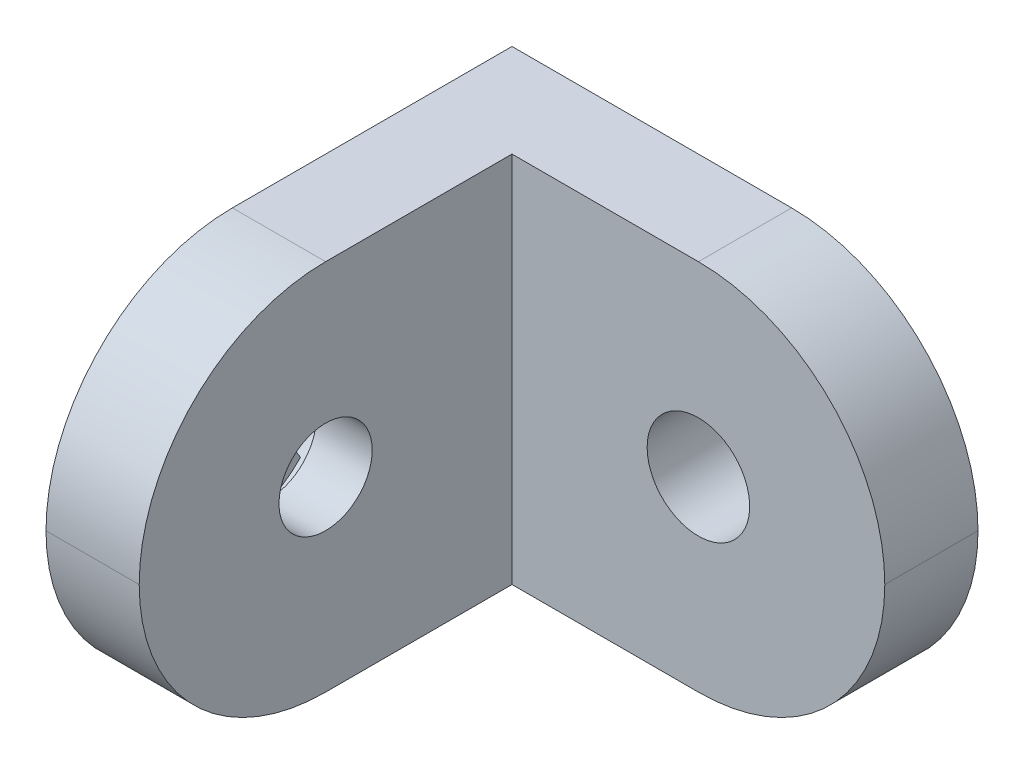
ISO-10303-21;
HEADER;
FILE_DESCRIPTION(('STEP AP214'),'2;1');
FILE_NAME('part.step','',(''),(''),'','','');
FILE_SCHEMA(('AUTOMOTIVE_DESIGN { 1 0 10303 214 1 1 1 1 }'));
ENDSEC;
DATA;
#1=APPLICATION_CONTEXT('core data for automotive mechanical design processes');
#2=APPLICATION_PROTOCOL_DEFINITION('international standard','automotive_design',2000,#1);
#3=PRODUCT_CONTEXT('',#1,'mechanical');
#4=PRODUCT('Part','Part','',(#3));
#5=PRODUCT_RELATED_PRODUCT_CATEGORY('part','',(#4));
#6=PRODUCT_DEFINITION_FORMATION('','',#4);
#7=PRODUCT_DEFINITION_CONTEXT('part definition',#1,'design');
#8=PRODUCT_DEFINITION('design','',#6,#7);
#9=PRODUCT_DEFINITION_SHAPE('','',#8);
#10=(LENGTH_UNIT() NAMED_UNIT(*) SI_UNIT(.MILLI.,.METRE.));
#11=(NAMED_UNIT(*) PLANE_ANGLE_UNIT() SI_UNIT($,.RADIAN.));
#12=(NAMED_UNIT(*) SI_UNIT($,.STERADIAN.) SOLID_ANGLE_UNIT());
#13=UNCERTAINTY_MEASURE_WITH_UNIT(LENGTH_MEASURE(1.E-05),#10,'distance_accuracy_value','');
#14=(GEOMETRIC_REPRESENTATION_CONTEXT(3) GLOBAL_UNCERTAINTY_ASSIGNED_CONTEXT((#13)) GLOBAL_UNIT_ASSIGNED_CONTEXT((#10,
#11,#12)) REPRESENTATION_CONTEXT('',''));
#15=CARTESIAN_POINT('',(0.,0.,0.));
#16=DIRECTION('',(0.,0.,1.));
#17=DIRECTION('',(1.,0.,0.));
#18=AXIS2_PLACEMENT_3D('',#15,#16,#17);
#19=CARTESIAN_POINT('',(55.,12.7,0.));
#20=DIRECTION('',(0.,1.,0.));
#21=DIRECTION('',(0.,0.,1.));
#22=AXIS2_PLACEMENT_3D('',#19,#20,#21);
#23=PLANE('',#22);
#24=DIRECTION('',(1.,0.,0.));
#25=VECTOR('',#24,1.);
#26=CARTESIAN_POINT('',(55.,12.7,0.));
#27=LINE('',#26,#25);
#28=CARTESIAN_POINT('',(35.0093624094842,12.7,0.));
#29=VERTEX_POINT('',#28);
#30=CARTESIAN_POINT('',(45.,12.7,0.));
#31=VERTEX_POINT('',#30);
#32=EDGE_CURVE('E215',#29,#31,#27,.T.);
#33=ORIENTED_EDGE('',*,*,#32,.T.);
#34=DIRECTION('',(0.,0.,1.));
#35=VECTOR('',#34,1.);
#36=CARTESIAN_POINT('',(45.,12.7,0.));
#37=LINE('',#36,#35);
#38=CARTESIAN_POINT('',(45.,12.7,4.99999999999999));
#39=VERTEX_POINT('',#38);
#40=EDGE_CURVE('E286',#39,#31,#37,.F.);
#41=ORIENTED_EDGE('',*,*,#40,.F.);
#42=DIRECTION('',(-1.,0.,0.));
#43=VECTOR('',#42,1.);
#44=CARTESIAN_POINT('',(55.,12.7,4.99999999999999));
#45=LINE('',#44,#43);
#46=CARTESIAN_POINT('',(35.0093624094842,12.7,4.99999999999999));
#47=VERTEX_POINT('',#46);
#48=EDGE_CURVE('E231',#39,#47,#45,.T.);
#49=ORIENTED_EDGE('',*,*,#48,.T.);
#50=DIRECTION('',(0.,0.,1.));
#51=VECTOR('',#50,1.);
#52=CARTESIAN_POINT('',(35.0093624094842,12.7,5.));
#53=LINE('',#52,#51);
#54=EDGE_CURVE('E292',#29,#47,#53,.T.);
#55=ORIENTED_EDGE('',*,*,#54,.F.);
#56=EDGE_LOOP('',(#33,#41,#49,#55));
#57=FACE_BOUND('',#56,.T.);
#58=ADVANCED_FACE('F35',(#57),#23,.F.);
#59=CARTESIAN_POINT('',(55.,32.7,4.99999999999999));
#60=DIRECTION('',(0.,0.,-1.));
#61=DIRECTION('',(1.,0.,0.));
#62=AXIS2_PLACEMENT_3D('',#59,#60,#61);
#63=PLANE('',#62);
#64=DIRECTION('',(-0.598801388197791,-0.800897557426915,0.));
#65=VECTOR('',#64,1.);
#66=CARTESIAN_POINT('',(46.1529562742384,39.3146063442278,4.99999999999999));
#67=LINE('',#66,#65);
#68=CARTESIAN_POINT('',(25.8009031631259,12.0937114923126,4.99999999999999));
#69=VERTEX_POINT('',#68);
#70=CARTESIAN_POINT('',(24.1612511255535,9.90067497335245,5.));
#71=VERTEX_POINT('',#70);
#72=EDGE_CURVE('E200',#69,#71,#67,.T.);
#73=ORIENTED_EDGE('',*,*,#72,.T.);
#74=DIRECTION('',(0.800897557426915,-0.598801388197791,0.));
#75=VECTOR('',#74,1.);
#76=CARTESIAN_POINT('',(33.008294851315,3.28606862912467,4.99999999999999));
#77=LINE('',#76,#75);
#78=CARTESIAN_POINT('',(20.9576608958458,12.2958805261436,5.));
#79=VERTEX_POINT('',#78);
#80=EDGE_CURVE('E203',#79,#71,#77,.T.);
#81=ORIENTED_EDGE('',*,*,#80,.F.);
#82=DIRECTION('',(-0.598801388197791,-0.800897557426915,0.));
#83=VECTOR('',#82,1.);
#84=CARTESIAN_POINT('',(42.9493660445308,41.7098118970189,4.99999999999999));
#85=LINE('',#84,#83);
#86=CARTESIAN_POINT('',(29.4026926722808,23.5911204094308,4.99999999999999));
#87=VERTEX_POINT('',#86);
#88=EDGE_CURVE('E197',#87,#79,#85,.T.);
#89=ORIENTED_EDGE('',*,*,#88,.F.);
#90=CARTESIAN_POINT('',(27.,25.3875245740242,4.99999999999999));
#91=DIRECTION('',(0.,0.,1.));
#92=DIRECTION('',(1.,0.,0.));
#93=AXIS2_PLACEMENT_3D('',#90,#91,#92);
#94=CIRCLE('',#93,3.);
#95=CARTESIAN_POINT('',(30.,25.3875245740242,4.99999999999999));
#96=VERTEX_POINT('',#95);
#97=EDGE_CURVE('E342',#96,#87,#94,.F.);
#98=ORIENTED_EDGE('',*,*,#97,.F.);
#99=DIRECTION('',(0.,1.,0.));
#100=VECTOR('',#99,1.);
#101=CARTESIAN_POINT('',(30.,0.,4.99999999999999));
#102=LINE('',#101,#100);
#103=CARTESIAN_POINT('',(30.,32.7,4.99999999999999));
#104=VERTEX_POINT('',#103);
#105=EDGE_CURVE('E241',#96,#104,#102,.T.);
#106=ORIENTED_EDGE('',*,*,#105,.T.);
#107=CARTESIAN_POINT('',(20.0000314668095,32.7250865541764,4.99999999999999));
#108=DIRECTION('',(0.,0.,1.));
#109=DIRECTION('',(1.,0.,0.));
#110=AXIS2_PLACEMENT_3D('',#107,#108,#109);
#111=CIRCLE('',#110,10.);
#112=CARTESIAN_POINT('',(28.0090070410787,26.7370726721985,4.99999999999999));
#113=VERTEX_POINT('',#112);
#114=EDGE_CURVE('E330',#113,#104,#111,.T.);
#115=ORIENTED_EDGE('',*,*,#114,.F.);
#116=DIRECTION('',(0.598801388197791,0.800897557426915,0.));
#117=VECTOR('',#116,1.);
#118=CARTESIAN_POINT('',(40.54667337225,43.5062160616123,4.99999999999999));
#119=LINE('',#118,#117);
#120=CARTESIAN_POINT('',(13.9955122128654,7.99400694098895,4.99999999999999));
#121=VERTEX_POINT('',#120);
#122=EDGE_CURVE('E232',#121,#113,#119,.T.);
#123=ORIENTED_EDGE('',*,*,#122,.F.);
#124=CARTESIAN_POINT('',(18.,5.,4.99999999999999));
#125=DIRECTION('',(0.,0.,1.));
#126=DIRECTION('',(1.,0.,0.));
#127=AXIS2_PLACEMENT_3D('',#124,#125,#126);
#128=CIRCLE('',#127,5.);
#129=CARTESIAN_POINT('',(22.0044877871346,2.00599305901105,4.99999999999999));
#130=VERTEX_POINT('',#129);
#131=EDGE_CURVE('E274',#130,#121,#128,.T.);
#132=ORIENTED_EDGE('',*,*,#131,.F.);
#133=DIRECTION('',(-0.598801388197791,-0.800897557426915,0.));
#134=VECTOR('',#133,1.);
#135=CARTESIAN_POINT('',(48.5556489465192,37.5182021796344,4.99999999999999));
#136=LINE('',#135,#134);
#137=CARTESIAN_POINT('',(27.000386835215,8.68801388197789,4.99999999999999));
#138=VERTEX_POINT('',#137);
#139=EDGE_CURVE('E235',#138,#130,#136,.T.);
#140=ORIENTED_EDGE('',*,*,#139,.F.);
#141=CARTESIAN_POINT('',(35.0093624094842,2.7,4.99999999999999));
#142=DIRECTION('',(0.,0.,1.));
#143=DIRECTION('',(1.,0.,0.));
#144=AXIS2_PLACEMENT_3D('',#141,#142,#143);
#145=CIRCLE('',#144,10.);
#146=CARTESIAN_POINT('',(35.,12.7,5.));
#147=VERTEX_POINT('',#146);
#148=EDGE_CURVE('E325',#147,#138,#145,.T.);
#149=ORIENTED_EDGE('',*,*,#148,.F.);
#150=DIRECTION('',(-1.,0.,0.));
#151=VECTOR('',#150,1.);
#152=CARTESIAN_POINT('',(55.,12.7,4.99999999999999));
#153=LINE('',#152,#151);
#154=CARTESIAN_POINT('',(30.,12.7,5.));
#155=VERTEX_POINT('',#154);
#156=EDGE_CURVE('E289',#147,#155,#153,.T.);
#157=ORIENTED_EDGE('',*,*,#156,.T.);
#158=CARTESIAN_POINT('',(28.2035958354066,10.2973073277193,4.99999999999999));
#159=DIRECTION('',(0.,0.,1.));
#160=DIRECTION('',(1.,0.,0.));
#161=AXIS2_PLACEMENT_3D('',#158,#159,#160);
#162=CIRCLE('',#161,3.);
#163=EDGE_CURVE('E345',#69,#155,#162,.F.);
#164=ORIENTED_EDGE('',*,*,#163,.F.);
#165=EDGE_LOOP('',(#73,#81,#89,#98,#106,#115,#123,#132,#140,#149,#157,#164));
#166=FACE_BOUND('',#165,.T.);
#167=ADVANCED_FACE('F358',(#166),#63,.F.);
#168=CARTESIAN_POINT('',(30.,0.,25.));
#169=DIRECTION('',(1.,0.,0.));
#170=DIRECTION('',(0.,0.,1.));
#171=AXIS2_PLACEMENT_3D('',#168,#169,#170);
#172=PLANE('',#171);
#173=DIRECTION('',(0.,0.,1.));
#174=VECTOR('',#173,1.);
#175=CARTESIAN_POINT('',(30.,12.7,0.));
#176=LINE('',#175,#174);
#177=CARTESIAN_POINT('',(30.,12.7,8.30783445332814));
#178=VERTEX_POINT('',#177);
#179=CARTESIAN_POINT('',(30.,12.7,15.));
#180=VERTEX_POINT('',#179);
#181=EDGE_CURVE('E222',#178,#180,#176,.T.);
#182=ORIENTED_EDGE('',*,*,#181,.T.);
#183=CARTESIAN_POINT('',(30.,22.7,15.));
#184=DIRECTION('',(-1.,0.,0.));
#185=DIRECTION('',(0.,0.,1.));
#186=AXIS2_PLACEMENT_3D('',#183,#184,#185);
#187=CIRCLE('',#186,10.);
#188=CARTESIAN_POINT('',(30.,22.7,25.));
#189=VERTEX_POINT('',#188);
#190=EDGE_CURVE('E299',#189,#180,#187,.F.);
#191=ORIENTED_EDGE('',*,*,#190,.F.);
#192=CARTESIAN_POINT('',(30.,22.7,15.));
#193=DIRECTION('',(-1.,0.,0.));
#194=DIRECTION('',(0.,0.,1.));
#195=AXIS2_PLACEMENT_3D('',#192,#193,#194);
#196=CIRCLE('',#195,10.);
#197=CARTESIAN_POINT('',(30.,32.7,15.));
#198=VERTEX_POINT('',#197);
#199=EDGE_CURVE('E302',#198,#189,#196,.F.);
#200=ORIENTED_EDGE('',*,*,#199,.F.);
#201=DIRECTION('',(0.,0.,-1.));
#202=VECTOR('',#201,1.);
#203=CARTESIAN_POINT('',(30.,32.7,25.));
#204=LINE('',#203,#202);
#205=EDGE_CURVE('E248',#198,#104,#204,.T.);
#206=ORIENTED_EDGE('',*,*,#205,.T.);
#207=ORIENTED_EDGE('',*,*,#105,.F.);
#208=DIRECTION('',(0.,0.,-1.));
#209=VECTOR('',#208,1.);
#210=CARTESIAN_POINT('',(30.,25.3875245740242,25.));
#211=LINE('',#210,#209);
#212=CARTESIAN_POINT('',(30.,25.3875245740242,10.7836969198104));
#213=VERTEX_POINT('',#212);
#214=EDGE_CURVE('E189',#213,#96,#211,.T.);
#215=ORIENTED_EDGE('',*,*,#214,.F.);
#216=CARTESIAN_POINT('',(30.,22.7,15.));
#217=DIRECTION('',(-1.,0.,0.));
#218=DIRECTION('',(0.,0.,1.));
#219=AXIS2_PLACEMENT_3D('',#216,#217,#218);
#220=CIRCLE('',#219,5.);
#221=CARTESIAN_POINT('',(30.,19.2849251009991,11.3479781717226));
#222=VERTEX_POINT('',#221);
#223=EDGE_CURVE('E168',#213,#222,#220,.F.);
#224=ORIENTED_EDGE('',*,*,#223,.T.);
#225=DIRECTION('',(0.,0.907909670834868,0.419165873616306));
#226=VECTOR('',#225,1.);
#227=CARTESIAN_POINT('',(30.,8.58384018988373,6.40747610472154));
#228=LINE('',#227,#226);
#229=EDGE_CURVE('E177',#178,#222,#228,.T.);
#230=ORIENTED_EDGE('',*,*,#229,.F.);
#231=EDGE_LOOP('',(#182,#191,#200,#206,#207,#215,#224,#230));
#232=FACE_BOUND('',#231,.T.);
#233=ADVANCED_FACE('F187',(#232),#172,.F.);
#234=CARTESIAN_POINT('',(45.,22.7,4.99999999999999));
#235=DIRECTION('',(0.,0.,-1.));
#236=DIRECTION('',(-1.,0.,0.));
#237=AXIS2_PLACEMENT_3D('',#234,#235,#236);
#238=CIRCLE('',#237,2.75);
#239=CARTESIAN_POINT('',(42.25,22.7,4.99999999999999));
#240=VERTEX_POINT('',#239);
#241=EDGE_CURVE('E265',#240,#240,#238,.T.);
#242=ORIENTED_EDGE('',*,*,#241,.T.);
#243=EDGE_LOOP('',(#242));
#244=FACE_BOUND('',#243,.T.);
#245=DIRECTION('',(-1.,0.,0.));
#246=VECTOR('',#245,1.);
#247=CARTESIAN_POINT('',(55.,32.7,4.99999999999999));
#248=LINE('',#247,#246);
#249=CARTESIAN_POINT('',(45.,32.7,4.99999999999999));
#250=VERTEX_POINT('',#249);
#251=CARTESIAN_POINT('',(35.,32.7,4.99999999999999));
#252=VERTEX_POINT('',#251);
#253=EDGE_CURVE('E271',#250,#252,#248,.T.);
#254=ORIENTED_EDGE('',*,*,#253,.T.);
#255=DIRECTION('',(0.,-1.,0.));
#256=VECTOR('',#255,1.);
#257=CARTESIAN_POINT('',(35.,0.,4.99999999999999));
#258=LINE('',#257,#256);
#259=EDGE_CURVE('E238',#252,#147,#258,.T.);
#260=ORIENTED_EDGE('',*,*,#259,.T.);
#261=EDGE_CURVE('E228',#47,#147,#45,.T.);
#262=ORIENTED_EDGE('',*,*,#261,.F.);
#263=ORIENTED_EDGE('',*,*,#48,.F.);
#264=CARTESIAN_POINT('',(45.,22.7,4.99999999999999));
#265=DIRECTION('',(0.,0.,1.));
#266=DIRECTION('',(1.,0.,0.));
#267=AXIS2_PLACEMENT_3D('',#264,#265,#266);
#268=CIRCLE('',#267,10.);
#269=CARTESIAN_POINT('',(55.,22.7,4.99999999999999));
#270=VERTEX_POINT('',#269);
#271=EDGE_CURVE('E309',#270,#39,#268,.F.);
#272=ORIENTED_EDGE('',*,*,#271,.F.);
#273=CARTESIAN_POINT('',(45.,22.7,4.99999999999999));
#274=DIRECTION('',(0.,0.,1.));
#275=DIRECTION('',(1.,0.,0.));
#276=AXIS2_PLACEMENT_3D('',#273,#274,#275);
#277=CIRCLE('',#276,10.);
#278=EDGE_CURVE('E311',#250,#270,#277,.F.);
#279=ORIENTED_EDGE('',*,*,#278,.F.);
#280=EDGE_LOOP('',(#254,#260,#262,#263,#272,#279));
#281=FACE_BOUND('',#280,.T.);
#282=ADVANCED_FACE('F403',(#244,#281),#63,.F.);
#283=CARTESIAN_POINT('',(45.,22.7,-5.00000000000001));
#284=DIRECTION('',(0.,0.,1.));
#285=DIRECTION('',(-1.,0.,0.));
#286=AXIS2_PLACEMENT_3D('',#283,#284,#285);
#287=CYLINDRICAL_SURFACE('',#286,2.75);
#288=ORIENTED_EDGE('',*,*,#241,.F.);
#289=EDGE_LOOP('',(#288));
#290=FACE_BOUND('',#289,.T.);
#291=CARTESIAN_POINT('',(45.,22.7,0.999999999999998));
#292=DIRECTION('',(0.,0.,1.));
#293=DIRECTION('',(1.,0.,0.));
#294=AXIS2_PLACEMENT_3D('',#291,#292,#293);
#295=CIRCLE('',#294,2.75);
#296=CARTESIAN_POINT('',(47.75,22.7,0.999999999999999));
#297=VERTEX_POINT('',#296);
#298=EDGE_CURVE('E262',#297,#297,#295,.F.);
#299=ORIENTED_EDGE('',*,*,#298,.T.);
#300=EDGE_LOOP('',(#299));
#301=FACE_BOUND('',#300,.T.);
#302=ADVANCED_FACE('F445',(#290,#301),#287,.F.);
#303=CARTESIAN_POINT('',(13.,32.7,0.));
#304=DIRECTION('',(0.,0.,1.));
#305=DIRECTION('',(-1.,0.,0.));
#306=AXIS2_PLACEMENT_3D('',#303,#304,#305);
#307=PLANE('',#306);
#308=CARTESIAN_POINT('',(18.,5.,0.));
#309=DIRECTION('',(0.,0.,1.));
#310=DIRECTION('',(1.,0.,0.));
#311=AXIS2_PLACEMENT_3D('',#308,#309,#310);
#312=CIRCLE('',#311,1.75);
#313=CARTESIAN_POINT('',(19.75,5.,0.));
#314=VERTEX_POINT('',#313);
#315=EDGE_CURVE('E255',#314,#314,#312,.T.);
#316=ORIENTED_EDGE('',*,*,#315,.T.);
#317=EDGE_LOOP('',(#316));
#318=FACE_BOUND('',#317,.T.);
#319=CARTESIAN_POINT('',(45.,22.7,0.));
#320=DIRECTION('',(0.,0.,1.));
#321=DIRECTION('',(1.,0.,0.));
#322=AXIS2_PLACEMENT_3D('',#319,#320,#321);
#323=CIRCLE('',#322,5.5);
#324=CARTESIAN_POINT('',(50.5,22.7,0.));
#325=VERTEX_POINT('',#324);
#326=EDGE_CURVE('E258',#325,#325,#323,.T.);
#327=ORIENTED_EDGE('',*,*,#326,.T.);
#328=EDGE_LOOP('',(#327));
#329=FACE_BOUND('',#328,.T.);
#330=CARTESIAN_POINT('',(45.,22.7,0.));
#331=DIRECTION('',(0.,0.,-1.));
#332=DIRECTION('',(-1.,0.,0.));
#333=AXIS2_PLACEMENT_3D('',#330,#331,#332);
#334=CIRCLE('',#333,10.);
#335=CARTESIAN_POINT('',(55.,22.7,0.));
#336=VERTEX_POINT('',#335);
#337=EDGE_CURVE('E314',#31,#336,#334,.F.);
#338=ORIENTED_EDGE('',*,*,#337,.F.);
#339=ORIENTED_EDGE('',*,*,#32,.F.);
#340=CARTESIAN_POINT('',(35.0093624094842,2.7,0.));
#341=DIRECTION('',(0.,0.,-1.));
#342=DIRECTION('',(-1.,0.,0.));
#343=AXIS2_PLACEMENT_3D('',#340,#341,#342);
#344=CIRCLE('',#343,10.);
#345=CARTESIAN_POINT('',(27.000386835215,8.68801388197791,0.));
#346=VERTEX_POINT('',#345);
#347=EDGE_CURVE('E328',#346,#29,#344,.T.);
#348=ORIENTED_EDGE('',*,*,#347,.F.);
#349=DIRECTION('',(0.598801388197791,0.800897557426915,0.));
#350=VECTOR('',#349,1.);
#351=CARTESIAN_POINT('',(30.,12.7,0.));
#352=LINE('',#351,#350);
#353=CARTESIAN_POINT('',(22.0044877871346,2.00599305901105,0.));
#354=VERTEX_POINT('',#353);
#355=EDGE_CURVE('E212',#354,#346,#352,.T.);
#356=ORIENTED_EDGE('',*,*,#355,.F.);
#357=CARTESIAN_POINT('',(18.,5.,0.));
#358=DIRECTION('',(0.,0.,1.));
#359=DIRECTION('',(-1.,0.,0.));
#360=AXIS2_PLACEMENT_3D('',#357,#358,#359);
#361=CIRCLE('',#360,4.99999999999999);
#362=CARTESIAN_POINT('',(13.9955122128654,7.99400694098895,0.));
#363=VERTEX_POINT('',#362);
#364=EDGE_CURVE('E209',#363,#354,#361,.T.);
#365=ORIENTED_EDGE('',*,*,#364,.F.);
#366=DIRECTION('',(-0.598801388197791,-0.800897557426915,0.));
#367=VECTOR('',#366,1.);
#368=CARTESIAN_POINT('',(13.9955122128654,7.99400694098895,0.));
#369=LINE('',#368,#367);
#370=CARTESIAN_POINT('',(28.0090070410787,26.7370726721985,0.));
#371=VERTEX_POINT('',#370);
#372=EDGE_CURVE('E206',#371,#363,#369,.T.);
#373=ORIENTED_EDGE('',*,*,#372,.F.);
#374=CARTESIAN_POINT('',(20.0000314668095,32.7250865541764,0.));
#375=DIRECTION('',(0.,0.,-1.));
#376=DIRECTION('',(-1.,0.,0.));
#377=AXIS2_PLACEMENT_3D('',#374,#375,#376);
#378=CIRCLE('',#377,10.);
#379=CARTESIAN_POINT('',(30.,32.7,0.));
#380=VERTEX_POINT('',#379);
#381=EDGE_CURVE('E333',#380,#371,#378,.T.);
#382=ORIENTED_EDGE('',*,*,#381,.F.);
#383=DIRECTION('',(1.,0.,0.));
#384=VECTOR('',#383,1.);
#385=CARTESIAN_POINT('',(13.,32.7,0.));
#386=LINE('',#385,#384);
#387=CARTESIAN_POINT('',(45.,32.7,0.));
#388=VERTEX_POINT('',#387);
#389=EDGE_CURVE('E268',#380,#388,#386,.T.);
#390=ORIENTED_EDGE('',*,*,#389,.T.);
#391=CARTESIAN_POINT('',(45.,22.7,0.));
#392=DIRECTION('',(0.,0.,-1.));
#393=DIRECTION('',(-1.,0.,0.));
#394=AXIS2_PLACEMENT_3D('',#391,#392,#393);
#395=CIRCLE('',#394,10.);
#396=EDGE_CURVE('E317',#336,#388,#395,.F.);
#397=ORIENTED_EDGE('',*,*,#396,.F.);
#398=EDGE_LOOP('',(#338,#339,#348,#356,#365,#373,#382,#390,#397));
#399=FACE_BOUND('',#398,.T.);
#400=ADVANCED_FACE('F448',(#318,#329,#399),#307,.F.);
#401=CARTESIAN_POINT('',(60.,32.7,0.));
#402=DIRECTION('',(0.,1.,0.));
#403=DIRECTION('',(0.,0.,1.));
#404=AXIS2_PLACEMENT_3D('',#401,#402,#403);
#405=PLANE('',#404);
#406=ORIENTED_EDGE('',*,*,#389,.F.);
#407=EDGE_CURVE('E246',#104,#380,#204,.T.);
#408=ORIENTED_EDGE('',*,*,#407,.F.);
#409=ORIENTED_EDGE('',*,*,#205,.F.);
#410=DIRECTION('',(1.,0.,0.));
#411=VECTOR('',#410,1.);
#412=CARTESIAN_POINT('',(30.,32.7,15.));
#413=LINE('',#412,#411);
#414=CARTESIAN_POINT('',(35.,32.7,15.));
#415=VERTEX_POINT('',#414);
#416=EDGE_CURVE('E305',#415,#198,#413,.F.);
#417=ORIENTED_EDGE('',*,*,#416,.F.);
#418=DIRECTION('',(0.,0.,-1.));
#419=VECTOR('',#418,1.);
#420=CARTESIAN_POINT('',(35.,32.7,25.));
#421=LINE('',#420,#419);
#422=EDGE_CURVE('E244',#415,#252,#421,.T.);
#423=ORIENTED_EDGE('',*,*,#422,.T.);
#424=ORIENTED_EDGE('',*,*,#253,.F.);
#425=DIRECTION('',(0.,0.,1.));
#426=VECTOR('',#425,1.);
#427=CARTESIAN_POINT('',(45.,32.7,4.99999999999999));
#428=LINE('',#427,#426);
#429=EDGE_CURVE('E307',#388,#250,#428,.T.);
#430=ORIENTED_EDGE('',*,*,#429,.F.);
#431=EDGE_LOOP('',(#406,#408,#409,#417,#423,#424,#430));
#432=FACE_BOUND('',#431,.T.);
#433=ADVANCED_FACE('F379',(#432),#405,.T.);
#434=CARTESIAN_POINT('',(45.,22.7,0.999999999999998));
#435=DIRECTION('',(0.,0.,-1.));
#436=DIRECTION('',(1.,0.,0.));
#437=AXIS2_PLACEMENT_3D('',#434,#435,#436);
#438=PLANE('',#437);
#439=CARTESIAN_POINT('',(45.,22.7,0.999999999999998));
#440=DIRECTION('',(0.,0.,1.));
#441=DIRECTION('',(1.,0.,0.));
#442=AXIS2_PLACEMENT_3D('',#439,#440,#441);
#443=CIRCLE('',#442,5.5);
#444=CARTESIAN_POINT('',(50.5,22.7,0.999999999999999));
#445=VERTEX_POINT('',#444);
#446=EDGE_CURVE('E259',#445,#445,#443,.T.);
#447=ORIENTED_EDGE('',*,*,#446,.F.);
#448=EDGE_LOOP('',(#447));
#449=FACE_BOUND('',#448,.T.);
#450=ORIENTED_EDGE('',*,*,#298,.F.);
#451=EDGE_LOOP('',(#450));
#452=FACE_BOUND('',#451,.T.);
#453=ADVANCED_FACE('F438',(#449,#452),#438,.T.);
#454=CARTESIAN_POINT('',(45.,22.7,0.999999999999998));
#455=DIRECTION('',(0.,0.,-1.));
#456=DIRECTION('',(1.,0.,0.));
#457=AXIS2_PLACEMENT_3D('',#454,#455,#456);
#458=CYLINDRICAL_SURFACE('',#457,5.5);
#459=ORIENTED_EDGE('',*,*,#446,.T.);
#460=EDGE_LOOP('',(#459));
#461=FACE_BOUND('',#460,.T.);
#462=ORIENTED_EDGE('',*,*,#326,.F.);
#463=EDGE_LOOP('',(#462));
#464=FACE_BOUND('',#463,.T.);
#465=ADVANCED_FACE('F436',(#461,#464),#458,.F.);
#466=CARTESIAN_POINT('',(18.,5.,12.));
#467=DIRECTION('',(0.,0.,-1.));
#468=DIRECTION('',(1.,0.,0.));
#469=AXIS2_PLACEMENT_3D('',#466,#467,#468);
#470=CYLINDRICAL_SURFACE('',#469,1.75);
#471=ORIENTED_EDGE('',*,*,#315,.F.);
#472=EDGE_LOOP('',(#471));
#473=FACE_BOUND('',#472,.T.);
#474=CARTESIAN_POINT('',(18.,5.,6.99999999999999));
#475=DIRECTION('',(0.,0.,-1.));
#476=DIRECTION('',(-1.,0.,0.));
#477=AXIS2_PLACEMENT_3D('',#474,#475,#476);
#478=CIRCLE('',#477,1.75);
#479=CARTESIAN_POINT('',(16.25,5.,6.99999999999999));
#480=VERTEX_POINT('',#479);
#481=EDGE_CURVE('E249',#480,#480,#478,.T.);
#482=ORIENTED_EDGE('',*,*,#481,.F.);
#483=EDGE_LOOP('',(#482));
#484=FACE_BOUND('',#483,.T.);
#485=ADVANCED_FACE('F432',(#473,#484),#470,.F.);
#486=CARTESIAN_POINT('',(18.,5.,6.99999999999999));
#487=DIRECTION('',(0.,0.,1.));
#488=DIRECTION('',(-1.,0.,0.));
#489=AXIS2_PLACEMENT_3D('',#486,#487,#488);
#490=PLANE('',#489);
#491=CARTESIAN_POINT('',(18.,5.,6.99999999999999));
#492=DIRECTION('',(0.,0.,-1.));
#493=DIRECTION('',(-1.,0.,0.));
#494=AXIS2_PLACEMENT_3D('',#491,#492,#493);
#495=CIRCLE('',#494,2.5);
#496=CARTESIAN_POINT('',(15.5,5.,6.99999999999999));
#497=VERTEX_POINT('',#496);
#498=EDGE_CURVE('E252',#497,#497,#495,.T.);
#499=ORIENTED_EDGE('',*,*,#498,.F.);
#500=EDGE_LOOP('',(#499));
#501=FACE_BOUND('',#500,.T.);
#502=ORIENTED_EDGE('',*,*,#481,.T.);
#503=EDGE_LOOP('',(#502));
#504=FACE_BOUND('',#503,.T.);
#505=ADVANCED_FACE('F429',(#501,#504),#490,.T.);
#506=CARTESIAN_POINT('',(18.,5.,6.99999999999999));
#507=DIRECTION('',(0.,0.,-1.));
#508=DIRECTION('',(1.,0.,0.));
#509=AXIS2_PLACEMENT_3D('',#506,#507,#508);
#510=CONICAL_SURFACE('',#509,2.5,0.896055384571343);
#511=EDGE_CURVE('E185',#121,#130,#128,.T.);
#512=ORIENTED_EDGE('',*,*,#511,.T.);
#513=ORIENTED_EDGE('',*,*,#131,.T.);
#514=EDGE_LOOP('',(#512,#513));
#515=FACE_BOUND('',#514,.T.);
#516=ORIENTED_EDGE('',*,*,#498,.T.);
#517=EDGE_LOOP('',(#516));
#518=FACE_BOUND('',#517,.T.);
#519=ADVANCED_FACE('F427',(#515,#518),#510,.T.);
#520=CARTESIAN_POINT('',(35.,0.,25.));
#521=DIRECTION('',(-1.,0.,0.));
#522=DIRECTION('',(0.,0.,-1.));
#523=AXIS2_PLACEMENT_3D('',#520,#521,#522);
#524=PLANE('',#523);
#525=CARTESIAN_POINT('',(35.,22.7,15.));
#526=DIRECTION('',(1.,0.,0.));
#527=DIRECTION('',(0.,0.,-1.));
#528=AXIS2_PLACEMENT_3D('',#525,#526,#527);
#529=CIRCLE('',#528,2.5);
#530=CARTESIAN_POINT('',(35.,22.7,12.5));
#531=VERTEX_POINT('',#530);
#532=EDGE_CURVE('E281',#531,#531,#529,.T.);
#533=ORIENTED_EDGE('',*,*,#532,.F.);
#534=EDGE_LOOP('',(#533));
#535=FACE_BOUND('',#534,.T.);
#536=CARTESIAN_POINT('',(35.,22.7,15.));
#537=DIRECTION('',(1.,0.,0.));
#538=DIRECTION('',(0.,0.,-1.));
#539=AXIS2_PLACEMENT_3D('',#536,#537,#538);
#540=CIRCLE('',#539,10.);
#541=CARTESIAN_POINT('',(35.,12.7,15.));
#542=VERTEX_POINT('',#541);
#543=CARTESIAN_POINT('',(35.,22.7,25.));
#544=VERTEX_POINT('',#543);
#545=EDGE_CURVE('E320',#542,#544,#540,.F.);
#546=ORIENTED_EDGE('',*,*,#545,.F.);
#547=DIRECTION('',(0.,0.,1.));
#548=VECTOR('',#547,1.);
#549=CARTESIAN_POINT('',(35.,12.7,25.));
#550=LINE('',#549,#548);
#551=EDGE_CURVE('E221',#147,#542,#550,.T.);
#552=ORIENTED_EDGE('',*,*,#551,.F.);
#553=ORIENTED_EDGE('',*,*,#259,.F.);
#554=ORIENTED_EDGE('',*,*,#422,.F.);
#555=CARTESIAN_POINT('',(35.,22.7,15.));
#556=DIRECTION('',(1.,0.,0.));
#557=DIRECTION('',(0.,0.,-1.));
#558=AXIS2_PLACEMENT_3D('',#555,#556,#557);
#559=CIRCLE('',#558,10.);
#560=EDGE_CURVE('E323',#544,#415,#559,.F.);
#561=ORIENTED_EDGE('',*,*,#560,.F.);
#562=EDGE_LOOP('',(#546,#552,#553,#554,#561));
#563=FACE_BOUND('',#562,.T.);
#564=ADVANCED_FACE('F424',(#535,#563),#524,.F.);
#565=CARTESIAN_POINT('',(18.,5.,0.));
#566=DIRECTION('',(0.,0.,1.));
#567=DIRECTION('',(-1.,0.,0.));
#568=AXIS2_PLACEMENT_3D('',#565,#566,#567);
#569=CYLINDRICAL_SURFACE('',#568,4.99999999999999);
#570=DIRECTION('',(0.,0.,1.));
#571=VECTOR('',#570,1.);
#572=CARTESIAN_POINT('',(22.0044877871346,2.00599305901105,0.));
#573=LINE('',#572,#571);
#574=EDGE_CURVE('E223',#354,#130,#573,.T.);
#575=ORIENTED_EDGE('',*,*,#574,.T.);
#576=ORIENTED_EDGE('',*,*,#511,.F.);
#577=DIRECTION('',(0.,0.,1.));
#578=VECTOR('',#577,1.);
#579=CARTESIAN_POINT('',(13.9955122128654,7.99400694098895,0.));
#580=LINE('',#579,#578);
#581=EDGE_CURVE('E218',#363,#121,#580,.T.);
#582=ORIENTED_EDGE('',*,*,#581,.F.);
#583=ORIENTED_EDGE('',*,*,#364,.T.);
#584=EDGE_LOOP('',(#575,#576,#582,#583));
#585=FACE_BOUND('',#584,.T.);
#586=ADVANCED_FACE('F418',(#585),#569,.T.);
#587=CARTESIAN_POINT('',(30.,12.7,0.));
#588=DIRECTION('',(-0.800897557426915,0.598801388197791,0.));
#589=DIRECTION('',(0.598801388197791,0.800897557426915,0.));
#590=AXIS2_PLACEMENT_3D('',#587,#588,#589);
#591=PLANE('',#590);
#592=ORIENTED_EDGE('',*,*,#139,.T.);
#593=ORIENTED_EDGE('',*,*,#574,.F.);
#594=ORIENTED_EDGE('',*,*,#355,.T.);
#595=DIRECTION('',(0.,0.,1.));
#596=VECTOR('',#595,1.);
#597=CARTESIAN_POINT('',(27.000386835215,8.68801388197791,0.));
#598=LINE('',#597,#596);
#599=EDGE_CURVE('E295',#138,#346,#598,.F.);
#600=ORIENTED_EDGE('',*,*,#599,.F.);
#601=EDGE_LOOP('',(#592,#593,#594,#600));
#602=FACE_BOUND('',#601,.T.);
#603=ADVANCED_FACE('F412',(#602),#591,.F.);
#604=CARTESIAN_POINT('',(13.9955122128654,7.99400694098895,0.));
#605=DIRECTION('',(0.800897557426915,-0.598801388197791,0.));
#606=DIRECTION('',(-0.598801388197791,-0.800897557426915,0.));
#607=AXIS2_PLACEMENT_3D('',#604,#605,#606);
#608=PLANE('',#607);
#609=ORIENTED_EDGE('',*,*,#372,.T.);
#610=ORIENTED_EDGE('',*,*,#581,.T.);
#611=ORIENTED_EDGE('',*,*,#122,.T.);
#612=DIRECTION('',(0.,0.,-1.));
#613=VECTOR('',#612,1.);
#614=CARTESIAN_POINT('',(28.0090070410787,26.7370726721985,0.));
#615=LINE('',#614,#613);
#616=EDGE_CURVE('E297',#371,#113,#615,.F.);
#617=ORIENTED_EDGE('',*,*,#616,.F.);
#618=EDGE_LOOP('',(#609,#610,#611,#617));
#619=FACE_BOUND('',#618,.T.);
#620=ADVANCED_FACE('F407',(#619),#608,.F.);
#621=ORIENTED_EDGE('',*,*,#551,.T.);
#622=DIRECTION('',(1.,0.,0.));
#623=VECTOR('',#622,1.);
#624=CARTESIAN_POINT('',(55.,12.7,15.));
#625=LINE('',#624,#623);
#626=EDGE_CURVE('E280',#180,#542,#625,.T.);
#627=ORIENTED_EDGE('',*,*,#626,.F.);
#628=ORIENTED_EDGE('',*,*,#181,.F.);
#629=EDGE_CURVE('E219',#155,#178,#176,.T.);
#630=ORIENTED_EDGE('',*,*,#629,.F.);
#631=ORIENTED_EDGE('',*,*,#156,.F.);
#632=EDGE_LOOP('',(#621,#627,#628,#630,#631));
#633=FACE_BOUND('',#632,.T.);
#634=ADVANCED_FACE('F364',(#633),#23,.F.);
#635=CARTESIAN_POINT('',(23.1097614692656,8.49430632762296,3.98774830568982));
#636=DIRECTION('',(-0.299052754820834,-0.399983409521895,0.866360618877215));
#637=DIRECTION('',(0.,-0.907909670834868,-0.419165873616306));
#638=AXIS2_PLACEMENT_3D('',#635,#636,#637);
#639=PLANE('',#638);
#640=DIRECTION('',(-0.518777941263573,-0.693866103509632,-0.499418940428464));
#641=VECTOR('',#640,1.);
#642=CARTESIAN_POINT('',(19.9061712395579,10.8895118804141,3.98774830568982));
#643=LINE('',#642,#641);
#644=CARTESIAN_POINT('',(26.8562202005583,20.1852104986412,10.6784454459239));
#645=VERTEX_POINT('',#644);
#646=EDGE_CURVE('E190',#645,#79,#643,.T.);
#647=ORIENTED_EDGE('',*,*,#646,.T.);
#648=ORIENTED_EDGE('',*,*,#80,.T.);
#649=DIRECTION('',(-0.518777941263573,-0.693866103509632,-0.499418940428464));
#650=VECTOR('',#649,1.);
#651=CARTESIAN_POINT('',(23.1097614692656,8.49430632762296,3.98774830568982));
#652=LINE('',#651,#650);
#653=CARTESIAN_POINT('',(25.8009031631259,12.0937114923126,6.57846588712172));
#654=VERTEX_POINT('',#653);
#655=EDGE_CURVE('E192',#654,#71,#652,.T.);
#656=ORIENTED_EDGE('',*,*,#655,.F.);
#657=CARTESIAN_POINT('',(28.2035958354066,10.2973073277193,6.57846588712173));
#658=DIRECTION('',(0.299052754820834,0.399983409521895,-0.866360618877215));
#659=DIRECTION('',(-0.518777941263574,-0.693866103509632,-0.499418940428464));
#660=AXIS2_PLACEMENT_3D('',#657,#658,#659);
#661=ELLIPSE('',#660,3.46276127357674,3.);
#662=EDGE_CURVE('E48',#178,#654,#661,.F.);
#663=ORIENTED_EDGE('',*,*,#662,.F.);
#664=ORIENTED_EDGE('',*,*,#229,.T.);
#665=CARTESIAN_POINT('',(36.0122990356723,22.7,15.));
#666=DIRECTION('',(0.299052754820834,0.399983409521895,-0.866360618877215));
#667=DIRECTION('',(0.954236579593378,-0.125352709231838,0.271512888191644));
#668=AXIS2_PLACEMENT_3D('',#665,#666,#667);
#669=ELLIPSE('',#668,16.7194580869036,5.);
#670=EDGE_CURVE('E164',#645,#222,#669,.F.);
#671=ORIENTED_EDGE('',*,*,#670,.F.);
#672=EDGE_LOOP('',(#647,#648,#656,#663,#664,#671));
#673=FACE_BOUND('',#672,.T.);
#674=ADVANCED_FACE('F178',(#673),#639,.T.);
#675=CARTESIAN_POINT('',(32.2635525742158,20.7375126421836,0.));
#676=DIRECTION('',(-0.800897557426915,0.598801388197791,0.));
#677=DIRECTION('',(0.598801388197791,0.800897557426915,0.));
#678=AXIS2_PLACEMENT_3D('',#675,#676,#677);
#679=PLANE('',#678);
#680=ORIENTED_EDGE('',*,*,#655,.T.);
#681=ORIENTED_EDGE('',*,*,#72,.F.);
#682=DIRECTION('',(0.,0.,-1.));
#683=VECTOR('',#682,1.);
#684=CARTESIAN_POINT('',(25.8009031631259,12.0937114923126,0.));
#685=LINE('',#684,#683);
#686=EDGE_CURVE('E336',#654,#69,#685,.T.);
#687=ORIENTED_EDGE('',*,*,#686,.F.);
#688=EDGE_LOOP('',(#680,#681,#687));
#689=FACE_BOUND('',#688,.T.);
#690=ADVANCED_FACE('F356',(#689),#679,.F.);
#691=CARTESIAN_POINT('',(29.0599623445082,23.1327181949748,0.));
#692=DIRECTION('',(-0.800897557426915,0.598801388197791,0.));
#693=DIRECTION('',(0.598801388197791,0.800897557426915,0.));
#694=AXIS2_PLACEMENT_3D('',#691,#692,#693);
#695=PLANE('',#694);
#696=ORIENTED_EDGE('',*,*,#88,.T.);
#697=ORIENTED_EDGE('',*,*,#646,.F.);
#698=CARTESIAN_POINT('',(28.7364350051543,22.7,15.));
#699=DIRECTION('',(0.800897557426915,-0.598801388197791,0.));
#700=DIRECTION('',(0.598801388197791,0.800897557426915,0.));
#701=AXIS2_PLACEMENT_3D('',#698,#699,#700);
#702=ELLIPSE('',#701,6.24299569106411,5.);
#703=CARTESIAN_POINT('',(29.4026926722808,23.5911204094308,10.080050364496));
#704=VERTEX_POINT('',#703);
#705=EDGE_CURVE('E171',#704,#645,#702,.F.);
#706=ORIENTED_EDGE('',*,*,#705,.F.);
#707=DIRECTION('',(0.,0.,-1.));
#708=VECTOR('',#707,1.);
#709=CARTESIAN_POINT('',(29.4026926722808,23.5911204094308,0.));
#710=LINE('',#709,#708);
#711=EDGE_CURVE('E349',#87,#704,#710,.F.);
#712=ORIENTED_EDGE('',*,*,#711,.F.);
#713=EDGE_LOOP('',(#696,#697,#706,#712));
#714=FACE_BOUND('',#713,.T.);
#715=ADVANCED_FACE('F386',(#714),#695,.T.);
#716=CARTESIAN_POINT('',(8.00000000000001,22.7,15.));
#717=DIRECTION('',(1.,0.,0.));
#718=DIRECTION('',(0.,0.,1.));
#719=AXIS2_PLACEMENT_3D('',#716,#717,#718);
#720=CYLINDRICAL_SURFACE('',#719,5.);
#721=CARTESIAN_POINT('',(32.,22.7,15.));
#722=DIRECTION('',(1.,0.,0.));
#723=DIRECTION('',(0.,0.,-1.));
#724=AXIS2_PLACEMENT_3D('',#721,#722,#723);
#725=CIRCLE('',#724,5.);
#726=CARTESIAN_POINT('',(32.,22.7,9.99999999999999));
#727=VERTEX_POINT('',#726);
#728=EDGE_CURVE('E174',#727,#727,#725,.T.);
#729=ORIENTED_EDGE('',*,*,#728,.T.);
#730=EDGE_LOOP('',(#729));
#731=FACE_BOUND('',#730,.T.);
#732=ORIENTED_EDGE('',*,*,#705,.T.);
#733=ORIENTED_EDGE('',*,*,#670,.T.);
#734=ORIENTED_EDGE('',*,*,#223,.F.);
#735=CARTESIAN_POINT('',(29.4026926722808,23.5911204094308,10.080050364496));
#736=CARTESIAN_POINT('',(29.4485655401675,23.6524496181735,10.0911490021264));
#737=CARTESIAN_POINT('',(29.4919365465806,23.7153811274809,10.1037410176622));
#738=CARTESIAN_POINT('',(29.5734738264586,23.8438294430653,10.1321507418333));
#739=CARTESIAN_POINT('',(29.6116403562405,23.9093461218193,10.1479682915173));
#740=CARTESIAN_POINT('',(29.6824601439389,24.0421414582407,10.1830136006072));
#741=CARTESIAN_POINT('',(29.7151304450282,24.1094138928617,10.2022304242385));
#742=CARTESIAN_POINT('',(29.775011335345,24.245233794576,10.244233212578));
#743=CARTESIAN_POINT('',(29.8022223851342,24.3137811535785,10.2670188759175));
#744=CARTESIAN_POINT('',(29.8756643569126,24.5204220159547,10.3408833330582));
#745=CARTESIAN_POINT('',(29.9137247585173,24.6595537136324,10.3974796725722));
#746=CARTESIAN_POINT('',(29.969036989305,24.9351928642835,10.5248498598358));
#747=CARTESIAN_POINT('',(29.986307344793,25.0717025468473,10.5956110194231));
#748=CARTESIAN_POINT('',(29.9963161190829,25.2357035078377,10.6905347624064));
#749=CARTESIAN_POINT('',(29.9977077306719,25.2663607615834,10.7087216096919));
#750=CARTESIAN_POINT('',(29.9995483660231,25.3272515351409,10.7457303484903));
#751=CARTESIAN_POINT('',(29.9999988869771,25.3574856518788,10.7645511828309));
#752=CARTESIAN_POINT('',(30.,25.3875245740242,10.7836969198104));
#753=B_SPLINE_CURVE_WITH_KNOTS('',3,(#735,#736,#737,#738,#739,#740,#741,#742,#743,#744,#745,
#746,#747,#748,#749,#750,#751,#752),.UNSPECIFIED.,.F.,.F.,(4,2,2,2,2,2,2,2,4),(0.,
0.232092129189606,0.464172823866509,0.69552004012991,0.926847730917151,1.38936807215992,
1.85147594913681,1.9584855236693,2.0653247253827),.UNSPECIFIED.);
#754=EDGE_CURVE('E11',#704,#213,#753,.T.);
#755=ORIENTED_EDGE('',*,*,#754,.F.);
#756=EDGE_LOOP('',(#732,#733,#734,#755));
#757=FACE_BOUND('',#756,.T.);
#758=ADVANCED_FACE('F166',(#731,#757),#720,.F.);
#759=CARTESIAN_POINT('',(32.,22.7,15.));
#760=DIRECTION('',(-1.,0.,0.));
#761=DIRECTION('',(0.,0.,-1.));
#762=AXIS2_PLACEMENT_3D('',#759,#760,#761);
#763=PLANE('',#762);
#764=CARTESIAN_POINT('',(32.,22.7,15.));
#765=DIRECTION('',(1.,0.,0.));
#766=DIRECTION('',(0.,0.,-1.));
#767=AXIS2_PLACEMENT_3D('',#764,#765,#766);
#768=CIRCLE('',#767,2.5);
#769=CARTESIAN_POINT('',(32.,22.7,12.5));
#770=VERTEX_POINT('',#769);
#771=EDGE_CURVE('E284',#770,#770,#768,.T.);
#772=ORIENTED_EDGE('',*,*,#771,.T.);
#773=EDGE_LOOP('',(#772));
#774=FACE_BOUND('',#773,.T.);
#775=ORIENTED_EDGE('',*,*,#728,.F.);
#776=EDGE_LOOP('',(#775));
#777=FACE_BOUND('',#776,.T.);
#778=ADVANCED_FACE('F393',(#774,#777),#763,.T.);
#779=CARTESIAN_POINT('',(44.,22.7,15.));
#780=DIRECTION('',(-1.,0.,0.));
#781=DIRECTION('',(0.,0.,-1.));
#782=AXIS2_PLACEMENT_3D('',#779,#780,#781);
#783=CYLINDRICAL_SURFACE('',#782,2.5);
#784=ORIENTED_EDGE('',*,*,#771,.F.);
#785=EDGE_LOOP('',(#784));
#786=FACE_BOUND('',#785,.T.);
#787=ORIENTED_EDGE('',*,*,#532,.T.);
#788=EDGE_LOOP('',(#787));
#789=FACE_BOUND('',#788,.T.);
#790=ADVANCED_FACE('F463',(#786,#789),#783,.F.);
#791=CARTESIAN_POINT('',(35.0093624094842,2.7,0.));
#792=DIRECTION('',(0.,0.,-1.));
#793=DIRECTION('',(1.,0.,0.));
#794=AXIS2_PLACEMENT_3D('',#791,#792,#793);
#795=CYLINDRICAL_SURFACE('',#794,10.);
#796=ORIENTED_EDGE('',*,*,#347,.T.);
#797=ORIENTED_EDGE('',*,*,#54,.T.);
#798=ORIENTED_EDGE('',*,*,#261,.T.);
#799=ORIENTED_EDGE('',*,*,#148,.T.);
#800=ORIENTED_EDGE('',*,*,#599,.T.);
#801=EDGE_LOOP('',(#796,#797,#798,#799,#800));
#802=FACE_BOUND('',#801,.T.);
#803=ADVANCED_FACE('F460',(#802),#795,.F.);
#804=CARTESIAN_POINT('',(20.0000314668095,32.7250865541764,25.));
#805=DIRECTION('',(0.,0.,-1.));
#806=DIRECTION('',(1.,0.,0.));
#807=AXIS2_PLACEMENT_3D('',#804,#805,#806);
#808=CYLINDRICAL_SURFACE('',#807,10.);
#809=ORIENTED_EDGE('',*,*,#381,.T.);
#810=ORIENTED_EDGE('',*,*,#616,.T.);
#811=ORIENTED_EDGE('',*,*,#114,.T.);
#812=ORIENTED_EDGE('',*,*,#407,.T.);
#813=EDGE_LOOP('',(#809,#810,#811,#812));
#814=FACE_BOUND('',#813,.T.);
#815=ADVANCED_FACE('F383',(#814),#808,.F.);
#816=CARTESIAN_POINT('',(45.,22.7,0.));
#817=DIRECTION('',(0.,0.,1.));
#818=DIRECTION('',(-1.,0.,0.));
#819=AXIS2_PLACEMENT_3D('',#816,#817,#818);
#820=CYLINDRICAL_SURFACE('',#819,10.);
#821=DIRECTION('',(0.,0.,1.));
#822=VECTOR('',#821,1.);
#823=CARTESIAN_POINT('',(55.,22.7,0.));
#824=LINE('',#823,#822);
#825=EDGE_CURVE('E337',#336,#270,#824,.T.);
#826=ORIENTED_EDGE('',*,*,#825,.T.);
#827=ORIENTED_EDGE('',*,*,#271,.T.);
#828=ORIENTED_EDGE('',*,*,#40,.T.);
#829=ORIENTED_EDGE('',*,*,#337,.T.);
#830=EDGE_LOOP('',(#826,#827,#828,#829));
#831=FACE_BOUND('',#830,.T.);
#832=ADVANCED_FACE('F467',(#831),#820,.T.);
#833=CARTESIAN_POINT('',(45.,22.7,0.));
#834=DIRECTION('',(0.,0.,-1.));
#835=DIRECTION('',(1.,0.,0.));
#836=AXIS2_PLACEMENT_3D('',#833,#834,#835);
#837=CYLINDRICAL_SURFACE('',#836,10.);
#838=ORIENTED_EDGE('',*,*,#396,.T.);
#839=ORIENTED_EDGE('',*,*,#429,.T.);
#840=ORIENTED_EDGE('',*,*,#278,.T.);
#841=ORIENTED_EDGE('',*,*,#825,.F.);
#842=EDGE_LOOP('',(#838,#839,#840,#841));
#843=FACE_BOUND('',#842,.T.);
#844=ADVANCED_FACE('F468',(#843),#837,.T.);
#845=CARTESIAN_POINT('',(55.,22.7,15.));
#846=DIRECTION('',(1.,0.,0.));
#847=DIRECTION('',(0.,0.,1.));
#848=AXIS2_PLACEMENT_3D('',#845,#846,#847);
#849=CYLINDRICAL_SURFACE('',#848,10.);
#850=ORIENTED_EDGE('',*,*,#626,.T.);
#851=ORIENTED_EDGE('',*,*,#545,.T.);
#852=DIRECTION('',(1.,0.,0.));
#853=VECTOR('',#852,1.);
#854=CARTESIAN_POINT('',(60.,22.7,25.));
#855=LINE('',#854,#853);
#856=EDGE_CURVE('E339',#544,#189,#855,.F.);
#857=ORIENTED_EDGE('',*,*,#856,.T.);
#858=ORIENTED_EDGE('',*,*,#190,.T.);
#859=EDGE_LOOP('',(#850,#851,#857,#858));
#860=FACE_BOUND('',#859,.T.);
#861=ADVANCED_FACE('F370',(#860),#849,.T.);
#862=CARTESIAN_POINT('',(60.,22.7,15.));
#863=DIRECTION('',(-1.,0.,0.));
#864=DIRECTION('',(0.,0.,-1.));
#865=AXIS2_PLACEMENT_3D('',#862,#863,#864);
#866=CYLINDRICAL_SURFACE('',#865,10.);
#867=ORIENTED_EDGE('',*,*,#199,.T.);
#868=ORIENTED_EDGE('',*,*,#856,.F.);
#869=ORIENTED_EDGE('',*,*,#560,.T.);
#870=ORIENTED_EDGE('',*,*,#416,.T.);
#871=EDGE_LOOP('',(#867,#868,#869,#870));
#872=FACE_BOUND('',#871,.T.);
#873=ADVANCED_FACE('F373',(#872),#866,.T.);
#874=CARTESIAN_POINT('',(28.2035958354066,10.2973073277193,25.));
#875=DIRECTION('',(0.,0.,-1.));
#876=DIRECTION('',(1.,0.,0.));
#877=AXIS2_PLACEMENT_3D('',#874,#875,#876);
#878=CYLINDRICAL_SURFACE('',#877,3.);
#879=ORIENTED_EDGE('',*,*,#662,.T.);
#880=ORIENTED_EDGE('',*,*,#686,.T.);
#881=ORIENTED_EDGE('',*,*,#163,.T.);
#882=ORIENTED_EDGE('',*,*,#629,.T.);
#883=EDGE_LOOP('',(#879,#880,#881,#882));
#884=FACE_BOUND('',#883,.T.);
#885=ADVANCED_FACE('F351',(#884),#878,.F.);
#886=CARTESIAN_POINT('',(27.,25.3875245740242,25.));
#887=DIRECTION('',(0.,0.,-1.));
#888=DIRECTION('',(1.,0.,0.));
#889=AXIS2_PLACEMENT_3D('',#886,#887,#888);
#890=CYLINDRICAL_SURFACE('',#889,3.);
#891=ORIENTED_EDGE('',*,*,#754,.T.);
#892=ORIENTED_EDGE('',*,*,#214,.T.);
#893=ORIENTED_EDGE('',*,*,#97,.T.);
#894=ORIENTED_EDGE('',*,*,#711,.T.);
#895=EDGE_LOOP('',(#891,#892,#893,#894));
#896=FACE_BOUND('',#895,.T.);
#897=ADVANCED_FACE('F37',(#896),#890,.F.);
#898=CLOSED_SHELL('',(#58,#167,#233,#282,#302,#400,#433,#453,#465,#485,#505,#519,#564,#586,#603,
#620,#634,#674,#690,#715,#758,#778,#790,#803,#815,#832,#844,#861,#873,#885,#897));
#899=MANIFOLD_SOLID_BREP('B2',#898);
#900=ADVANCED_BREP_SHAPE_REPRESENTATION('',(#18,#899),#14);
#901=SHAPE_DEFINITION_REPRESENTATION(#9,#900);
ENDSEC;
END-ISO-10303-21;
